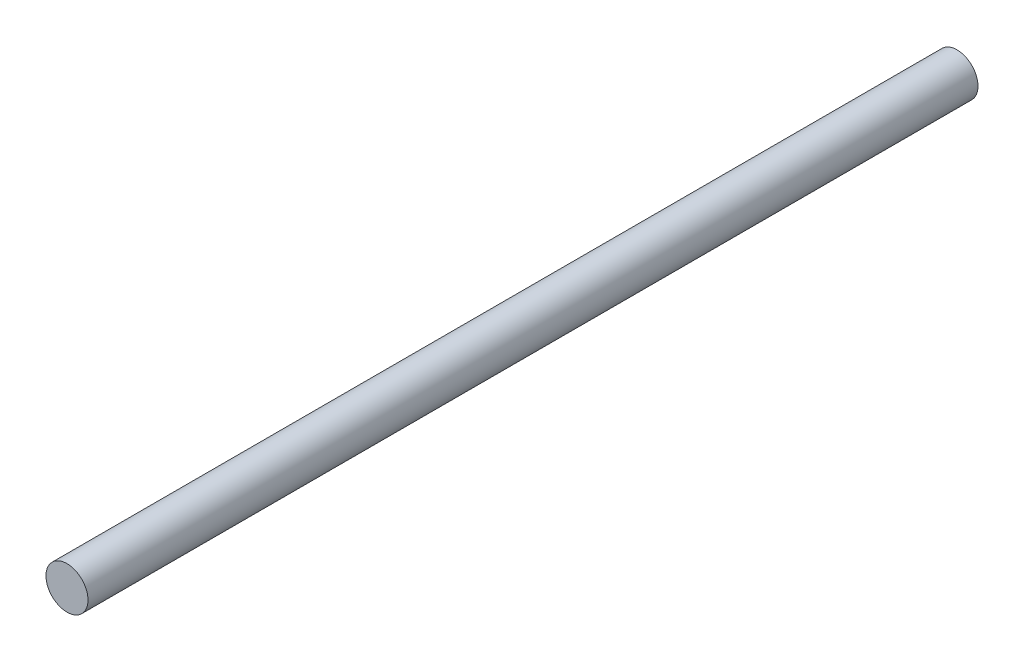
ISO-10303-21;
HEADER;
FILE_DESCRIPTION(('STEP AP214'),'2;1');
FILE_NAME('part.step','',(''),(''),'','','');
FILE_SCHEMA(('AUTOMOTIVE_DESIGN { 1 0 10303 214 1 1 1 1 }'));
ENDSEC;
DATA;
#1=APPLICATION_CONTEXT('core data for automotive mechanical design processes');
#2=APPLICATION_PROTOCOL_DEFINITION('international standard','automotive_design',2000,#1);
#3=PRODUCT_CONTEXT('',#1,'mechanical');
#4=PRODUCT('Part','Part','',(#3));
#5=PRODUCT_RELATED_PRODUCT_CATEGORY('part','',(#4));
#6=PRODUCT_DEFINITION_FORMATION('','',#4);
#7=PRODUCT_DEFINITION_CONTEXT('part definition',#1,'design');
#8=PRODUCT_DEFINITION('design','',#6,#7);
#9=PRODUCT_DEFINITION_SHAPE('','',#8);
#10=(LENGTH_UNIT() NAMED_UNIT(*) SI_UNIT(.MILLI.,.METRE.));
#11=(NAMED_UNIT(*) PLANE_ANGLE_UNIT() SI_UNIT($,.RADIAN.));
#12=(NAMED_UNIT(*) SI_UNIT($,.STERADIAN.) SOLID_ANGLE_UNIT());
#13=UNCERTAINTY_MEASURE_WITH_UNIT(LENGTH_MEASURE(1.E-05),#10,'distance_accuracy_value','');
#14=(GEOMETRIC_REPRESENTATION_CONTEXT(3) GLOBAL_UNCERTAINTY_ASSIGNED_CONTEXT((#13)) GLOBAL_UNIT_ASSIGNED_CONTEXT((#10,
#11,#12)) REPRESENTATION_CONTEXT('',''));
#15=CARTESIAN_POINT('',(0.,0.,0.));
#16=DIRECTION('',(0.,0.,1.));
#17=DIRECTION('',(1.,0.,0.));
#18=AXIS2_PLACEMENT_3D('',#15,#16,#17);
#19=CARTESIAN_POINT('',(0.,0.,63.5));
#20=DIRECTION('',(0.,0.,-1.));
#21=DIRECTION('',(-1.,0.,0.));
#22=AXIS2_PLACEMENT_3D('',#19,#20,#21);
#23=CYLINDRICAL_SURFACE('',#22,3.);
#24=CARTESIAN_POINT('',(0.,0.,63.5));
#25=DIRECTION('',(0.,0.,1.));
#26=DIRECTION('',(1.,0.,0.));
#27=AXIS2_PLACEMENT_3D('',#24,#25,#26);
#28=CIRCLE('',#27,3.);
#29=CARTESIAN_POINT('',(3.,0.,63.5));
#30=VERTEX_POINT('',#29);
#31=EDGE_CURVE('E10',#30,#30,#28,.T.);
#32=ORIENTED_EDGE('',*,*,#31,.F.);
#33=EDGE_LOOP('',(#32));
#34=FACE_BOUND('',#33,.T.);
#35=CARTESIAN_POINT('',(0.,0.,-63.5));
#36=DIRECTION('',(0.,0.,1.));
#37=DIRECTION('',(1.,0.,0.));
#38=AXIS2_PLACEMENT_3D('',#35,#36,#37);
#39=CIRCLE('',#38,3.);
#40=CARTESIAN_POINT('',(3.,0.,-63.5));
#41=VERTEX_POINT('',#40);
#42=EDGE_CURVE('E46',#41,#41,#39,.T.);
#43=ORIENTED_EDGE('',*,*,#42,.T.);
#44=EDGE_LOOP('',(#43));
#45=FACE_BOUND('',#44,.T.);
#46=ADVANCED_FACE('F43',(#34,#45),#23,.T.);
#47=CARTESIAN_POINT('',(0.,0.,63.5));
#48=DIRECTION('',(0.,0.,1.));
#49=DIRECTION('',(1.,0.,0.));
#50=AXIS2_PLACEMENT_3D('',#47,#48,#49);
#51=PLANE('',#50);
#52=ORIENTED_EDGE('',*,*,#31,.T.);
#53=EDGE_LOOP('',(#52));
#54=FACE_BOUND('',#53,.T.);
#55=ADVANCED_FACE('F58',(#54),#51,.T.);
#56=CARTESIAN_POINT('',(0.,0.,-63.5));
#57=DIRECTION('',(0.,0.,1.));
#58=DIRECTION('',(1.,0.,0.));
#59=AXIS2_PLACEMENT_3D('',#56,#57,#58);
#60=PLANE('',#59);
#61=ORIENTED_EDGE('',*,*,#42,.F.);
#62=EDGE_LOOP('',(#61));
#63=FACE_BOUND('',#62,.T.);
#64=ADVANCED_FACE('F59',(#63),#60,.F.);
#65=CLOSED_SHELL('',(#46,#55,#64));
#66=MANIFOLD_SOLID_BREP('B2',#65);
#67=ADVANCED_BREP_SHAPE_REPRESENTATION('',(#18,#66),#14);
#68=SHAPE_DEFINITION_REPRESENTATION(#9,#67);
ENDSEC;
END-ISO-10303-21;
